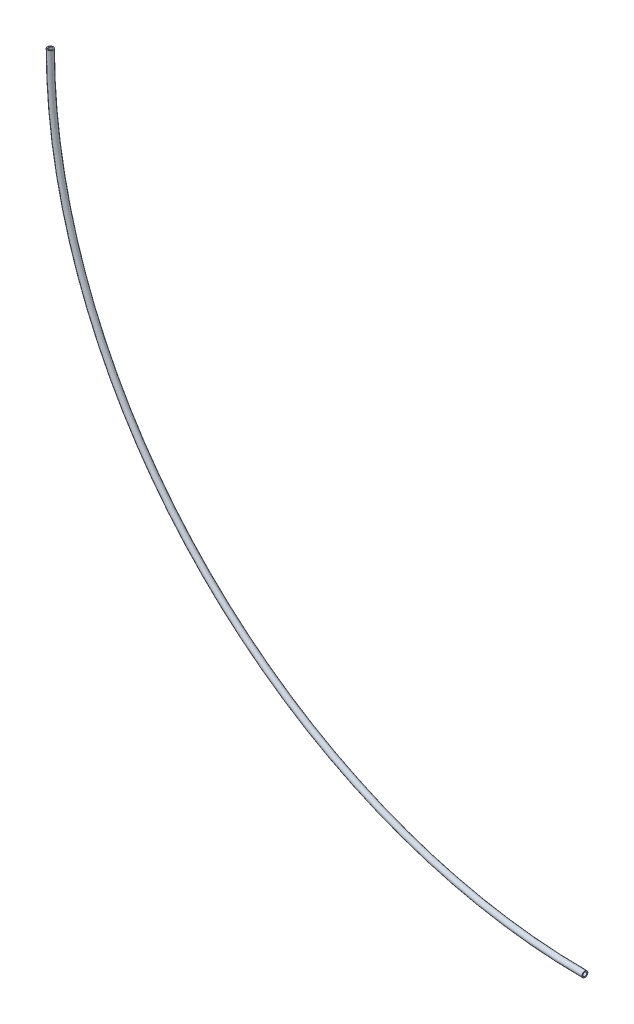
ISO-10303-21;
HEADER;
FILE_DESCRIPTION(('STEP AP214'),'2;1');
FILE_NAME('part.step','',(''),(''),'','','');
FILE_SCHEMA(('AUTOMOTIVE_DESIGN { 1 0 10303 214 1 1 1 1 }'));
ENDSEC;
DATA;
#1=APPLICATION_CONTEXT('core data for automotive mechanical design processes');
#2=APPLICATION_PROTOCOL_DEFINITION('international standard','automotive_design',2000,#1);
#3=PRODUCT_CONTEXT('',#1,'mechanical');
#4=PRODUCT('Part','Part','',(#3));
#5=PRODUCT_RELATED_PRODUCT_CATEGORY('part','',(#4));
#6=PRODUCT_DEFINITION_FORMATION('','',#4);
#7=PRODUCT_DEFINITION_CONTEXT('part definition',#1,'design');
#8=PRODUCT_DEFINITION('design','',#6,#7);
#9=PRODUCT_DEFINITION_SHAPE('','',#8);
#10=(LENGTH_UNIT() NAMED_UNIT(*) SI_UNIT(.MILLI.,.METRE.));
#11=(NAMED_UNIT(*) PLANE_ANGLE_UNIT() SI_UNIT($,.RADIAN.));
#12=(NAMED_UNIT(*) SI_UNIT($,.STERADIAN.) SOLID_ANGLE_UNIT());
#13=UNCERTAINTY_MEASURE_WITH_UNIT(LENGTH_MEASURE(1.E-05),#10,'distance_accuracy_value','');
#14=(GEOMETRIC_REPRESENTATION_CONTEXT(3) GLOBAL_UNCERTAINTY_ASSIGNED_CONTEXT((#13)) GLOBAL_UNIT_ASSIGNED_CONTEXT((#10,
#11,#12)) REPRESENTATION_CONTEXT('',''));
#15=CARTESIAN_POINT('',(0.,0.,0.));
#16=DIRECTION('',(0.,0.,1.));
#17=DIRECTION('',(1.,0.,0.));
#18=AXIS2_PLACEMENT_3D('',#15,#16,#17);
#19=CARTESIAN_POINT('',(-1100.,1.34711147906209E-13,0.));
#20=DIRECTION('',(0.,-1.,0.));
#21=DIRECTION('',(0.,0.,-1.));
#22=AXIS2_PLACEMENT_3D('',#19,#20,#21);
#23=PLANE('',#22);
#24=CARTESIAN_POINT('',(-1100.,0.,0.));
#25=DIRECTION('',(0.,-1.,0.));
#26=DIRECTION('',(0.,0.,-1.));
#27=AXIS2_PLACEMENT_3D('',#24,#25,#26);
#28=CIRCLE('',#27,4.00000000000001);
#29=CARTESIAN_POINT('',(-1104.,0.,0.));
#30=VERTEX_POINT('',#29);
#31=EDGE_CURVE('E60',#30,#30,#28,.T.);
#32=ORIENTED_EDGE('',*,*,#31,.T.);
#33=EDGE_LOOP('',(#32));
#34=FACE_BOUND('',#33,.T.);
#35=CARTESIAN_POINT('',(-1100.,1.34711147906209E-13,0.));
#36=DIRECTION('',(0.,-1.,0.));
#37=DIRECTION('',(0.,0.,-1.));
#38=AXIS2_PLACEMENT_3D('',#35,#36,#37);
#39=CIRCLE('',#38,6.00000000000001);
#40=CARTESIAN_POINT('',(-1106.,1.35445935985697E-13,0.));
#41=VERTEX_POINT('',#40);
#42=EDGE_CURVE('E50',#41,#41,#39,.T.);
#43=ORIENTED_EDGE('',*,*,#42,.F.);
#44=EDGE_LOOP('',(#43));
#45=FACE_BOUND('',#44,.T.);
#46=ADVANCED_FACE('F43',(#34,#45),#23,.F.);
#47=CARTESIAN_POINT('',(-2.02066721859313E-13,-1100.,0.));
#48=DIRECTION('',(1.,0.,0.));
#49=DIRECTION('',(0.,0.,-1.));
#50=AXIS2_PLACEMENT_3D('',#47,#48,#49);
#51=PLANE('',#50);
#52=CARTESIAN_POINT('',(0.,-1100.,0.));
#53=DIRECTION('',(1.,0.,0.));
#54=DIRECTION('',(0.,1.,0.));
#55=AXIS2_PLACEMENT_3D('',#52,#53,#54);
#56=CIRCLE('',#55,4.00000000000001);
#57=CARTESIAN_POINT('',(0.,-1104.,0.));
#58=VERTEX_POINT('',#57);
#59=EDGE_CURVE('E55',#58,#58,#56,.T.);
#60=ORIENTED_EDGE('',*,*,#59,.F.);
#61=EDGE_LOOP('',(#60));
#62=FACE_BOUND('',#61,.T.);
#63=CARTESIAN_POINT('',(-2.02066721859313E-13,-1100.,0.));
#64=DIRECTION('',(1.,0.,0.));
#65=DIRECTION('',(0.,0.,-1.));
#66=AXIS2_PLACEMENT_3D('',#63,#64,#65);
#67=CIRCLE('',#66,6.00000000000001);
#68=CARTESIAN_POINT('',(-2.03168903978546E-13,-1106.,0.));
#69=VERTEX_POINT('',#68);
#70=EDGE_CURVE('E11',#69,#69,#67,.T.);
#71=ORIENTED_EDGE('',*,*,#70,.T.);
#72=EDGE_LOOP('',(#71));
#73=FACE_BOUND('',#72,.T.);
#74=ADVANCED_FACE('F77',(#62,#73),#51,.T.);
#75=CARTESIAN_POINT('',(0.,0.,0.));
#76=DIRECTION('',(0.,0.,1.));
#77=DIRECTION('',(1.,0.,0.));
#78=AXIS2_PLACEMENT_3D('',#75,#76,#77);
#79=TOROIDAL_SURFACE('',#78,1100.,6.00000000000001);
#80=CARTESIAN_POINT('',(0.,0.,0.));
#81=DIRECTION('',(0.,0.,1.));
#82=DIRECTION('',(1.,0.,0.));
#83=AXIS2_PLACEMENT_3D('',#80,#81,#82);
#84=CIRCLE('',#83,1106.);
#85=EDGE_CURVE('',#41,#69,#84,.T.);
#86=ORIENTED_EDGE('',*,*,#42,.T.);
#87=ORIENTED_EDGE('',*,*,#70,.F.);
#88=ORIENTED_EDGE('',*,*,#85,.T.);
#89=ORIENTED_EDGE('',*,*,#85,.F.);
#90=EDGE_LOOP('',(#86,#88,#87,#89));
#91=FACE_BOUND('',#90,.T.);
#92=ADVANCED_FACE('F71',(#91),#79,.T.);
#93=CARTESIAN_POINT('',(0.,0.,0.));
#94=DIRECTION('',(0.,0.,1.));
#95=DIRECTION('',(1.,0.,0.));
#96=AXIS2_PLACEMENT_3D('',#93,#94,#95);
#97=TOROIDAL_SURFACE('',#96,1100.,4.00000000000001);
#98=CARTESIAN_POINT('',(0.,0.,0.));
#99=DIRECTION('',(0.,0.,1.));
#100=DIRECTION('',(1.,0.,0.));
#101=AXIS2_PLACEMENT_3D('',#98,#99,#100);
#102=CIRCLE('',#101,1104.);
#103=EDGE_CURVE('',#30,#58,#102,.T.);
#104=ORIENTED_EDGE('',*,*,#31,.F.);
#105=ORIENTED_EDGE('',*,*,#59,.T.);
#106=ORIENTED_EDGE('',*,*,#103,.T.);
#107=ORIENTED_EDGE('',*,*,#103,.F.);
#108=EDGE_LOOP('',(#104,#106,#105,#107));
#109=FACE_BOUND('',#108,.T.);
#110=ADVANCED_FACE('F69',(#109),#97,.F.);
#111=CLOSED_SHELL('',(#46,#74,#92,#110));
#112=MANIFOLD_SOLID_BREP('B2',#111);
#113=ADVANCED_BREP_SHAPE_REPRESENTATION('',(#18,#112),#14);
#114=SHAPE_DEFINITION_REPRESENTATION(#9,#113);
ENDSEC;
END-ISO-10303-21;
